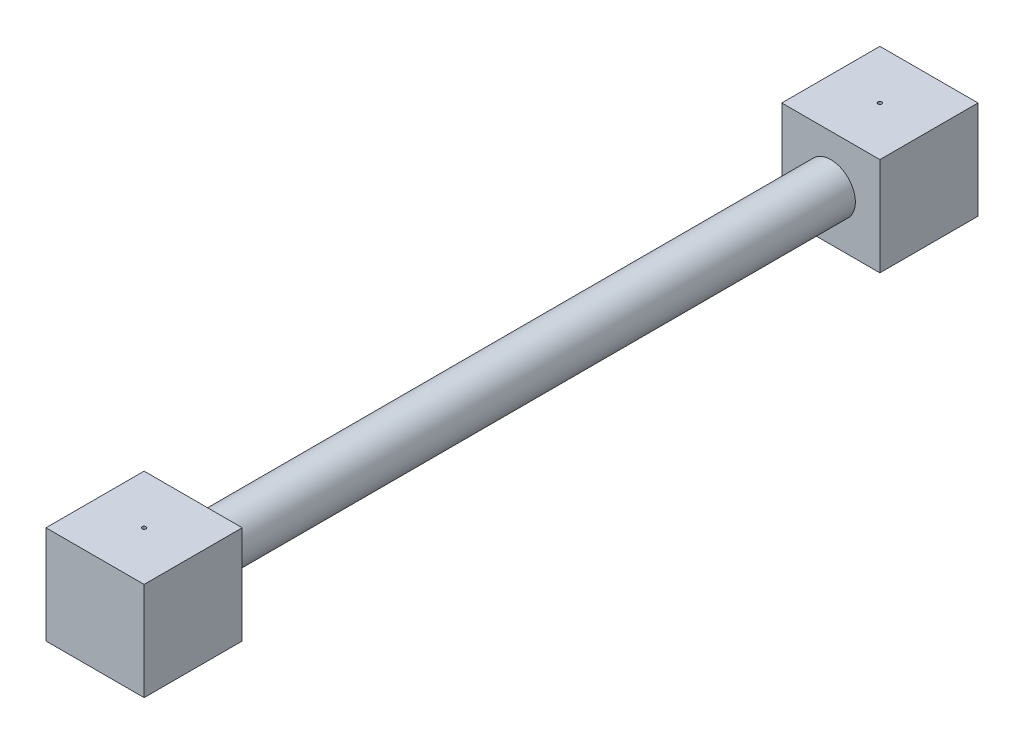
ISO-10303-21;
HEADER;
FILE_DESCRIPTION(('STEP AP214'),'2;1');
FILE_NAME('part.step','',(''),(''),'','','');
FILE_SCHEMA(('AUTOMOTIVE_DESIGN { 1 0 10303 214 1 1 1 1 }'));
ENDSEC;
DATA;
#1=APPLICATION_CONTEXT('core data for automotive mechanical design processes');
#2=APPLICATION_PROTOCOL_DEFINITION('international standard','automotive_design',2000,#1);
#3=PRODUCT_CONTEXT('',#1,'mechanical');
#4=PRODUCT('Part','Part','',(#3));
#5=PRODUCT_RELATED_PRODUCT_CATEGORY('part','',(#4));
#6=PRODUCT_DEFINITION_FORMATION('','',#4);
#7=PRODUCT_DEFINITION_CONTEXT('part definition',#1,'design');
#8=PRODUCT_DEFINITION('design','',#6,#7);
#9=PRODUCT_DEFINITION_SHAPE('','',#8);
#10=(LENGTH_UNIT() NAMED_UNIT(*) SI_UNIT(.MILLI.,.METRE.));
#11=(NAMED_UNIT(*) PLANE_ANGLE_UNIT() SI_UNIT($,.RADIAN.));
#12=(NAMED_UNIT(*) SI_UNIT($,.STERADIAN.) SOLID_ANGLE_UNIT());
#13=UNCERTAINTY_MEASURE_WITH_UNIT(LENGTH_MEASURE(1.E-05),#10,'distance_accuracy_value','');
#14=(GEOMETRIC_REPRESENTATION_CONTEXT(3) GLOBAL_UNCERTAINTY_ASSIGNED_CONTEXT((#13)) GLOBAL_UNIT_ASSIGNED_CONTEXT((#10,
#11,#12)) REPRESENTATION_CONTEXT('',''));
#15=CARTESIAN_POINT('',(0.,0.,0.));
#16=DIRECTION('',(0.,0.,1.));
#17=DIRECTION('',(1.,0.,0.));
#18=AXIS2_PLACEMENT_3D('',#15,#16,#17);
#19=CARTESIAN_POINT('',(-25.4,-25.4,-25.4));
#20=DIRECTION('',(1.,0.,0.));
#21=DIRECTION('',(0.,0.,-1.));
#22=AXIS2_PLACEMENT_3D('',#19,#20,#21);
#23=PLANE('',#22);
#24=DIRECTION('',(0.,1.,0.));
#25=VECTOR('',#24,1.);
#26=CARTESIAN_POINT('',(-25.4,-25.4,25.4));
#27=LINE('',#26,#25);
#28=CARTESIAN_POINT('',(-25.4,-25.4,25.4));
#29=VERTEX_POINT('',#28);
#30=CARTESIAN_POINT('',(-25.4,25.4,25.4));
#31=VERTEX_POINT('',#30);
#32=EDGE_CURVE('E142',#29,#31,#27,.T.);
#33=ORIENTED_EDGE('',*,*,#32,.T.);
#34=DIRECTION('',(0.,0.,1.));
#35=VECTOR('',#34,1.);
#36=CARTESIAN_POINT('',(-25.4,25.4,-25.4));
#37=LINE('',#36,#35);
#38=CARTESIAN_POINT('',(-25.4,25.4,-25.4));
#39=VERTEX_POINT('',#38);
#40=EDGE_CURVE('E48',#39,#31,#37,.T.);
#41=ORIENTED_EDGE('',*,*,#40,.F.);
#42=DIRECTION('',(0.,1.,0.));
#43=VECTOR('',#42,1.);
#44=CARTESIAN_POINT('',(-25.4,-25.4,-25.4));
#45=LINE('',#44,#43);
#46=CARTESIAN_POINT('',(-25.4,-25.4,-25.4));
#47=VERTEX_POINT('',#46);
#48=EDGE_CURVE('E147',#47,#39,#45,.T.);
#49=ORIENTED_EDGE('',*,*,#48,.F.);
#50=DIRECTION('',(0.,0.,1.));
#51=VECTOR('',#50,1.);
#52=CARTESIAN_POINT('',(-25.4,-25.4,-25.4));
#53=LINE('',#52,#51);
#54=EDGE_CURVE('E153',#47,#29,#53,.T.);
#55=ORIENTED_EDGE('',*,*,#54,.T.);
#56=EDGE_LOOP('',(#33,#41,#49,#55));
#57=FACE_BOUND('',#56,.T.);
#58=ADVANCED_FACE('F38',(#57),#23,.F.);
#59=CARTESIAN_POINT('',(25.4,25.4,-25.4));
#60=DIRECTION('',(0.,-1.,0.));
#61=DIRECTION('',(0.,0.,-1.));
#62=AXIS2_PLACEMENT_3D('',#59,#60,#61);
#63=PLANE('',#62);
#64=CARTESIAN_POINT('',(0.,25.4,0.));
#65=DIRECTION('',(0.,1.,0.));
#66=DIRECTION('',(0.,0.,1.));
#67=AXIS2_PLACEMENT_3D('',#64,#65,#66);
#68=CIRCLE('',#67,0.9921875);
#69=CARTESIAN_POINT('',(0.,25.4,0.9921875));
#70=VERTEX_POINT('',#69);
#71=EDGE_CURVE('E202',#70,#70,#68,.T.);
#72=ORIENTED_EDGE('',*,*,#71,.F.);
#73=EDGE_LOOP('',(#72));
#74=FACE_BOUND('',#73,.T.);
#75=DIRECTION('',(1.,0.,0.));
#76=VECTOR('',#75,1.);
#77=CARTESIAN_POINT('',(25.4,25.4,25.4));
#78=LINE('',#77,#76);
#79=CARTESIAN_POINT('',(25.4,25.4,25.4));
#80=VERTEX_POINT('',#79);
#81=EDGE_CURVE('E156',#31,#80,#78,.T.);
#82=ORIENTED_EDGE('',*,*,#81,.T.);
#83=DIRECTION('',(0.,0.,1.));
#84=VECTOR('',#83,1.);
#85=CARTESIAN_POINT('',(25.4,25.4,-25.4));
#86=LINE('',#85,#84);
#87=CARTESIAN_POINT('',(25.4,25.4,-25.4));
#88=VERTEX_POINT('',#87);
#89=EDGE_CURVE('E163',#88,#80,#86,.T.);
#90=ORIENTED_EDGE('',*,*,#89,.F.);
#91=DIRECTION('',(1.,0.,0.));
#92=VECTOR('',#91,1.);
#93=CARTESIAN_POINT('',(25.4,25.4,-25.4));
#94=LINE('',#93,#92);
#95=EDGE_CURVE('E88',#39,#88,#94,.T.);
#96=ORIENTED_EDGE('',*,*,#95,.F.);
#97=ORIENTED_EDGE('',*,*,#40,.T.);
#98=EDGE_LOOP('',(#82,#90,#96,#97));
#99=FACE_BOUND('',#98,.T.);
#100=ADVANCED_FACE('F166',(#74,#99),#63,.F.);
#101=CARTESIAN_POINT('',(25.4,-25.4,-25.4));
#102=DIRECTION('',(-1.,0.,0.));
#103=DIRECTION('',(0.,0.,1.));
#104=AXIS2_PLACEMENT_3D('',#101,#102,#103);
#105=PLANE('',#104);
#106=DIRECTION('',(0.,-1.,0.));
#107=VECTOR('',#106,1.);
#108=CARTESIAN_POINT('',(25.4,-25.4,25.4));
#109=LINE('',#108,#107);
#110=CARTESIAN_POINT('',(25.4,-25.4,25.4));
#111=VERTEX_POINT('',#110);
#112=EDGE_CURVE('E74',#80,#111,#109,.T.);
#113=ORIENTED_EDGE('',*,*,#112,.T.);
#114=DIRECTION('',(0.,0.,1.));
#115=VECTOR('',#114,1.);
#116=CARTESIAN_POINT('',(25.4,-25.4,-25.4));
#117=LINE('',#116,#115);
#118=CARTESIAN_POINT('',(25.4,-25.4,-25.4));
#119=VERTEX_POINT('',#118);
#120=EDGE_CURVE('E161',#119,#111,#117,.T.);
#121=ORIENTED_EDGE('',*,*,#120,.F.);
#122=DIRECTION('',(0.,-1.,0.));
#123=VECTOR('',#122,1.);
#124=CARTESIAN_POINT('',(25.4,-25.4,-25.4));
#125=LINE('',#124,#123);
#126=EDGE_CURVE('E150',#88,#119,#125,.T.);
#127=ORIENTED_EDGE('',*,*,#126,.F.);
#128=ORIENTED_EDGE('',*,*,#89,.T.);
#129=EDGE_LOOP('',(#113,#121,#127,#128));
#130=FACE_BOUND('',#129,.T.);
#131=ADVANCED_FACE('F189',(#130),#105,.F.);
#132=CARTESIAN_POINT('',(25.4,-25.4,-25.4));
#133=DIRECTION('',(0.,1.,0.));
#134=DIRECTION('',(0.,0.,1.));
#135=AXIS2_PLACEMENT_3D('',#132,#133,#134);
#136=PLANE('',#135);
#137=CARTESIAN_POINT('',(0.,-25.4,0.));
#138=DIRECTION('',(0.,1.,0.));
#139=DIRECTION('',(0.,0.,1.));
#140=AXIS2_PLACEMENT_3D('',#137,#138,#139);
#141=CIRCLE('',#140,0.9921875);
#142=CARTESIAN_POINT('',(0.,-25.4,0.9921875));
#143=VERTEX_POINT('',#142);
#144=EDGE_CURVE('E200',#143,#143,#141,.T.);
#145=ORIENTED_EDGE('',*,*,#144,.T.);
#146=EDGE_LOOP('',(#145));
#147=FACE_BOUND('',#146,.T.);
#148=DIRECTION('',(-1.,0.,0.));
#149=VECTOR('',#148,1.);
#150=CARTESIAN_POINT('',(25.4,-25.4,25.4));
#151=LINE('',#150,#149);
#152=EDGE_CURVE('E80',#111,#29,#151,.T.);
#153=ORIENTED_EDGE('',*,*,#152,.T.);
#154=ORIENTED_EDGE('',*,*,#54,.F.);
#155=DIRECTION('',(-1.,0.,0.));
#156=VECTOR('',#155,1.);
#157=CARTESIAN_POINT('',(25.4,-25.4,-25.4));
#158=LINE('',#157,#156);
#159=EDGE_CURVE('E56',#119,#47,#158,.T.);
#160=ORIENTED_EDGE('',*,*,#159,.F.);
#161=ORIENTED_EDGE('',*,*,#120,.T.);
#162=EDGE_LOOP('',(#153,#154,#160,#161));
#163=FACE_BOUND('',#162,.T.);
#164=ADVANCED_FACE('F181',(#147,#163),#136,.F.);
#165=CARTESIAN_POINT('',(0.,0.,-25.4));
#166=DIRECTION('',(0.,0.,1.));
#167=DIRECTION('',(1.,0.,0.));
#168=AXIS2_PLACEMENT_3D('',#165,#166,#167);
#169=PLANE('',#168);
#170=ORIENTED_EDGE('',*,*,#48,.T.);
#171=ORIENTED_EDGE('',*,*,#95,.T.);
#172=ORIENTED_EDGE('',*,*,#126,.T.);
#173=ORIENTED_EDGE('',*,*,#159,.T.);
#174=EDGE_LOOP('',(#170,#171,#172,#173));
#175=FACE_BOUND('',#174,.T.);
#176=ADVANCED_FACE('F173',(#175),#169,.F.);
#177=CARTESIAN_POINT('',(0.,0.,25.4));
#178=DIRECTION('',(0.,0.,1.));
#179=DIRECTION('',(1.,0.,0.));
#180=AXIS2_PLACEMENT_3D('',#177,#178,#179);
#181=PLANE('',#180);
#182=CARTESIAN_POINT('',(0.,0.,25.4));
#183=DIRECTION('',(0.,0.,1.));
#184=DIRECTION('',(1.,0.,0.));
#185=AXIS2_PLACEMENT_3D('',#182,#183,#184);
#186=CIRCLE('',#185,12.7);
#187=CARTESIAN_POINT('',(12.7,0.,25.4));
#188=VERTEX_POINT('',#187);
#189=EDGE_CURVE('E11',#188,#188,#186,.T.);
#190=ORIENTED_EDGE('',*,*,#189,.F.);
#191=EDGE_LOOP('',(#190));
#192=FACE_BOUND('',#191,.T.);
#193=ORIENTED_EDGE('',*,*,#32,.F.);
#194=ORIENTED_EDGE('',*,*,#152,.F.);
#195=ORIENTED_EDGE('',*,*,#112,.F.);
#196=ORIENTED_EDGE('',*,*,#81,.F.);
#197=EDGE_LOOP('',(#193,#194,#195,#196));
#198=FACE_BOUND('',#197,.T.);
#199=ADVANCED_FACE('F171',(#192,#198),#181,.T.);
#200=CARTESIAN_POINT('',(0.,0.,381.));
#201=DIRECTION('',(0.,0.,-1.));
#202=DIRECTION('',(-1.,0.,0.));
#203=AXIS2_PLACEMENT_3D('',#200,#201,#202);
#204=CYLINDRICAL_SURFACE('',#203,12.7);
#205=CARTESIAN_POINT('',(0.,0.,355.6));
#206=DIRECTION('',(0.,0.,-1.));
#207=DIRECTION('',(-1.,0.,0.));
#208=AXIS2_PLACEMENT_3D('',#205,#206,#207);
#209=CIRCLE('',#208,12.7);
#210=CARTESIAN_POINT('',(-12.7,0.,355.6));
#211=VERTEX_POINT('',#210);
#212=EDGE_CURVE('E42',#211,#211,#209,.T.);
#213=ORIENTED_EDGE('',*,*,#212,.T.);
#214=EDGE_LOOP('',(#213));
#215=FACE_BOUND('',#214,.T.);
#216=ORIENTED_EDGE('',*,*,#189,.T.);
#217=EDGE_LOOP('',(#216));
#218=FACE_BOUND('',#217,.T.);
#219=ADVANCED_FACE('F40',(#215,#218),#204,.T.);
#220=CARTESIAN_POINT('',(25.4,-25.4,406.4));
#221=DIRECTION('',(-1.,0.,0.));
#222=DIRECTION('',(0.,0.,1.));
#223=AXIS2_PLACEMENT_3D('',#220,#221,#222);
#224=PLANE('',#223);
#225=DIRECTION('',(0.,1.,0.));
#226=VECTOR('',#225,1.);
#227=CARTESIAN_POINT('',(25.4,-25.4,355.6));
#228=LINE('',#227,#226);
#229=CARTESIAN_POINT('',(25.4,-25.4,355.6));
#230=VERTEX_POINT('',#229);
#231=CARTESIAN_POINT('',(25.4,25.4,355.6));
#232=VERTEX_POINT('',#231);
#233=EDGE_CURVE('E139',#230,#232,#228,.T.);
#234=ORIENTED_EDGE('',*,*,#233,.T.);
#235=DIRECTION('',(0.,0.,-1.));
#236=VECTOR('',#235,1.);
#237=CARTESIAN_POINT('',(25.4,25.4,406.4));
#238=LINE('',#237,#236);
#239=CARTESIAN_POINT('',(25.4,25.4,406.4));
#240=VERTEX_POINT('',#239);
#241=EDGE_CURVE('E119',#240,#232,#238,.T.);
#242=ORIENTED_EDGE('',*,*,#241,.F.);
#243=DIRECTION('',(0.,1.,0.));
#244=VECTOR('',#243,1.);
#245=CARTESIAN_POINT('',(25.4,-25.4,406.4));
#246=LINE('',#245,#244);
#247=CARTESIAN_POINT('',(25.4,-25.4,406.4));
#248=VERTEX_POINT('',#247);
#249=EDGE_CURVE('E126',#248,#240,#246,.T.);
#250=ORIENTED_EDGE('',*,*,#249,.F.);
#251=DIRECTION('',(0.,0.,-1.));
#252=VECTOR('',#251,1.);
#253=CARTESIAN_POINT('',(25.4,-25.4,406.4));
#254=LINE('',#253,#252);
#255=EDGE_CURVE('E211',#248,#230,#254,.T.);
#256=ORIENTED_EDGE('',*,*,#255,.T.);
#257=EDGE_LOOP('',(#234,#242,#250,#256));
#258=FACE_BOUND('',#257,.T.);
#259=ADVANCED_FACE('F137',(#258),#224,.F.);
#260=CARTESIAN_POINT('',(-25.4,25.4,406.4));
#261=DIRECTION('',(0.,-1.,0.));
#262=DIRECTION('',(0.,0.,-1.));
#263=AXIS2_PLACEMENT_3D('',#260,#261,#262);
#264=PLANE('',#263);
#265=CARTESIAN_POINT('',(0.,25.4,381.));
#266=DIRECTION('',(0.,1.,0.));
#267=DIRECTION('',(0.,0.,1.));
#268=AXIS2_PLACEMENT_3D('',#265,#266,#267);
#269=CIRCLE('',#268,1.01599999999999);
#270=CARTESIAN_POINT('',(0.,25.4,382.016));
#271=VERTEX_POINT('',#270);
#272=EDGE_CURVE('E205',#271,#271,#269,.T.);
#273=ORIENTED_EDGE('',*,*,#272,.F.);
#274=EDGE_LOOP('',(#273));
#275=FACE_BOUND('',#274,.T.);
#276=DIRECTION('',(-1.,0.,0.));
#277=VECTOR('',#276,1.);
#278=CARTESIAN_POINT('',(-25.4,25.4,355.6));
#279=LINE('',#278,#277);
#280=CARTESIAN_POINT('',(-25.4,25.4,355.6));
#281=VERTEX_POINT('',#280);
#282=EDGE_CURVE('E213',#232,#281,#279,.T.);
#283=ORIENTED_EDGE('',*,*,#282,.T.);
#284=DIRECTION('',(0.,0.,-1.));
#285=VECTOR('',#284,1.);
#286=CARTESIAN_POINT('',(-25.4,25.4,406.4));
#287=LINE('',#286,#285);
#288=CARTESIAN_POINT('',(-25.4,25.4,406.4));
#289=VERTEX_POINT('',#288);
#290=EDGE_CURVE('E122',#289,#281,#287,.T.);
#291=ORIENTED_EDGE('',*,*,#290,.F.);
#292=DIRECTION('',(-1.,0.,0.));
#293=VECTOR('',#292,1.);
#294=CARTESIAN_POINT('',(-25.4,25.4,406.4));
#295=LINE('',#294,#293);
#296=EDGE_CURVE('E115',#240,#289,#295,.T.);
#297=ORIENTED_EDGE('',*,*,#296,.F.);
#298=ORIENTED_EDGE('',*,*,#241,.T.);
#299=EDGE_LOOP('',(#283,#291,#297,#298));
#300=FACE_BOUND('',#299,.T.);
#301=ADVANCED_FACE('F117',(#275,#300),#264,.F.);
#302=CARTESIAN_POINT('',(-25.4,-25.4,406.4));
#303=DIRECTION('',(1.,0.,0.));
#304=DIRECTION('',(0.,0.,-1.));
#305=AXIS2_PLACEMENT_3D('',#302,#303,#304);
#306=PLANE('',#305);
#307=DIRECTION('',(0.,-1.,0.));
#308=VECTOR('',#307,1.);
#309=CARTESIAN_POINT('',(-25.4,-25.4,355.6));
#310=LINE('',#309,#308);
#311=CARTESIAN_POINT('',(-25.4,-25.4,355.6));
#312=VERTEX_POINT('',#311);
#313=EDGE_CURVE('E216',#281,#312,#310,.T.);
#314=ORIENTED_EDGE('',*,*,#313,.T.);
#315=DIRECTION('',(0.,0.,-1.));
#316=VECTOR('',#315,1.);
#317=CARTESIAN_POINT('',(-25.4,-25.4,406.4));
#318=LINE('',#317,#316);
#319=CARTESIAN_POINT('',(-25.4,-25.4,406.4));
#320=VERTEX_POINT('',#319);
#321=EDGE_CURVE('E143',#320,#312,#318,.T.);
#322=ORIENTED_EDGE('',*,*,#321,.F.);
#323=DIRECTION('',(0.,-1.,0.));
#324=VECTOR('',#323,1.);
#325=CARTESIAN_POINT('',(-25.4,-25.4,406.4));
#326=LINE('',#325,#324);
#327=EDGE_CURVE('E125',#289,#320,#326,.T.);
#328=ORIENTED_EDGE('',*,*,#327,.F.);
#329=ORIENTED_EDGE('',*,*,#290,.T.);
#330=EDGE_LOOP('',(#314,#322,#328,#329));
#331=FACE_BOUND('',#330,.T.);
#332=ADVANCED_FACE('F228',(#331),#306,.F.);
#333=CARTESIAN_POINT('',(-25.4,-25.4,406.4));
#334=DIRECTION('',(0.,1.,0.));
#335=DIRECTION('',(0.,0.,1.));
#336=AXIS2_PLACEMENT_3D('',#333,#334,#335);
#337=PLANE('',#336);
#338=CARTESIAN_POINT('',(0.,-25.4,381.));
#339=DIRECTION('',(0.,1.,0.));
#340=DIRECTION('',(0.,0.,1.));
#341=AXIS2_PLACEMENT_3D('',#338,#339,#340);
#342=CIRCLE('',#341,1.01599999999999);
#343=CARTESIAN_POINT('',(0.,-25.4,382.016));
#344=VERTEX_POINT('',#343);
#345=EDGE_CURVE('E214',#344,#344,#342,.T.);
#346=ORIENTED_EDGE('',*,*,#345,.T.);
#347=EDGE_LOOP('',(#346));
#348=FACE_BOUND('',#347,.T.);
#349=DIRECTION('',(1.,0.,0.));
#350=VECTOR('',#349,1.);
#351=CARTESIAN_POINT('',(-25.4,-25.4,355.6));
#352=LINE('',#351,#350);
#353=EDGE_CURVE('E135',#312,#230,#352,.T.);
#354=ORIENTED_EDGE('',*,*,#353,.T.);
#355=ORIENTED_EDGE('',*,*,#255,.F.);
#356=DIRECTION('',(1.,0.,0.));
#357=VECTOR('',#356,1.);
#358=CARTESIAN_POINT('',(-25.4,-25.4,406.4));
#359=LINE('',#358,#357);
#360=EDGE_CURVE('E131',#320,#248,#359,.T.);
#361=ORIENTED_EDGE('',*,*,#360,.F.);
#362=ORIENTED_EDGE('',*,*,#321,.T.);
#363=EDGE_LOOP('',(#354,#355,#361,#362));
#364=FACE_BOUND('',#363,.T.);
#365=ADVANCED_FACE('F223',(#348,#364),#337,.F.);
#366=CARTESIAN_POINT('',(0.,0.,406.4));
#367=DIRECTION('',(0.,0.,-1.));
#368=DIRECTION('',(-1.,0.,0.));
#369=AXIS2_PLACEMENT_3D('',#366,#367,#368);
#370=PLANE('',#369);
#371=ORIENTED_EDGE('',*,*,#249,.T.);
#372=ORIENTED_EDGE('',*,*,#296,.T.);
#373=ORIENTED_EDGE('',*,*,#327,.T.);
#374=ORIENTED_EDGE('',*,*,#360,.T.);
#375=EDGE_LOOP('',(#371,#372,#373,#374));
#376=FACE_BOUND('',#375,.T.);
#377=ADVANCED_FACE('F129',(#376),#370,.F.);
#378=CARTESIAN_POINT('',(0.,0.,355.6));
#379=DIRECTION('',(0.,0.,-1.));
#380=DIRECTION('',(-1.,0.,0.));
#381=AXIS2_PLACEMENT_3D('',#378,#379,#380);
#382=PLANE('',#381);
#383=ORIENTED_EDGE('',*,*,#212,.F.);
#384=EDGE_LOOP('',(#383));
#385=FACE_BOUND('',#384,.T.);
#386=ORIENTED_EDGE('',*,*,#233,.F.);
#387=ORIENTED_EDGE('',*,*,#353,.F.);
#388=ORIENTED_EDGE('',*,*,#313,.F.);
#389=ORIENTED_EDGE('',*,*,#282,.F.);
#390=EDGE_LOOP('',(#386,#387,#388,#389));
#391=FACE_BOUND('',#390,.T.);
#392=ADVANCED_FACE('F227',(#385,#391),#382,.T.);
#393=CARTESIAN_POINT('',(0.,-25.4,381.));
#394=DIRECTION('',(0.,1.,0.));
#395=DIRECTION('',(0.,0.,1.));
#396=AXIS2_PLACEMENT_3D('',#393,#394,#395);
#397=CYLINDRICAL_SURFACE('',#396,1.01599999999999);
#398=CARTESIAN_POINT('',(0.,-25.4,382.016));
#399=CARTESIAN_POINT('',(0.,-24.8708333333333,382.016));
#400=CARTESIAN_POINT('',(0.,-24.3416666666667,382.016));
#401=CARTESIAN_POINT('',(0.,-23.2833333333333,382.016));
#402=CARTESIAN_POINT('',(0.,-22.7541666666667,382.016));
#403=CARTESIAN_POINT('',(0.,-21.6958333333333,382.016));
#404=CARTESIAN_POINT('',(0.,-21.1666666666667,382.016));
#405=CARTESIAN_POINT('',(0.,-20.1083333333333,382.016));
#406=CARTESIAN_POINT('',(0.,-19.5791666666667,382.016));
#407=CARTESIAN_POINT('',(0.,-18.5208333333333,382.016));
#408=CARTESIAN_POINT('',(0.,-17.9916666666667,382.016));
#409=CARTESIAN_POINT('',(0.,-16.9333333333333,382.016));
#410=CARTESIAN_POINT('',(0.,-16.4041666666667,382.016));
#411=CARTESIAN_POINT('',(0.,-15.3458333333333,382.016));
#412=CARTESIAN_POINT('',(0.,-14.8166666666667,382.016));
#413=CARTESIAN_POINT('',(0.,-13.7583333333333,382.016));
#414=CARTESIAN_POINT('',(0.,-13.2291666666667,382.016));
#415=CARTESIAN_POINT('',(0.,-12.1708333333333,382.016));
#416=CARTESIAN_POINT('',(0.,-11.6416666666667,382.016));
#417=CARTESIAN_POINT('',(0.,-10.5833333333333,382.016));
#418=CARTESIAN_POINT('',(0.,-10.0541666666667,382.016));
#419=CARTESIAN_POINT('',(0.,-8.99583333333334,382.016));
#420=CARTESIAN_POINT('',(0.,-8.46666666666667,382.016));
#421=CARTESIAN_POINT('',(0.,-7.40833333333333,382.016));
#422=CARTESIAN_POINT('',(0.,-6.87916666666667,382.016));
#423=CARTESIAN_POINT('',(0.,-5.82083333333334,382.016));
#424=CARTESIAN_POINT('',(0.,-5.29166666666667,382.016));
#425=CARTESIAN_POINT('',(0.,-4.23333333333334,382.016));
#426=CARTESIAN_POINT('',(0.,-3.70416666666667,382.016));
#427=CARTESIAN_POINT('',(0.,-2.64583333333333,382.016));
#428=CARTESIAN_POINT('',(0.,-2.11666666666667,382.016));
#429=CARTESIAN_POINT('',(0.,-1.05833333333333,382.016));
#430=CARTESIAN_POINT('',(0.,-0.529166666666666,382.016));
#431=CARTESIAN_POINT('',(0.,0.529166666666666,382.016));
#432=CARTESIAN_POINT('',(0.,1.05833333333333,382.016));
#433=CARTESIAN_POINT('',(0.,2.11666666666667,382.016));
#434=CARTESIAN_POINT('',(0.,2.64583333333333,382.016));
#435=CARTESIAN_POINT('',(0.,3.70416666666667,382.016));
#436=CARTESIAN_POINT('',(0.,4.23333333333334,382.016));
#437=CARTESIAN_POINT('',(0.,5.29166666666667,382.016));
#438=CARTESIAN_POINT('',(0.,5.82083333333333,382.016));
#439=CARTESIAN_POINT('',(0.,6.87916666666666,382.016));
#440=CARTESIAN_POINT('',(0.,7.40833333333333,382.016));
#441=CARTESIAN_POINT('',(0.,8.46666666666667,382.016));
#442=CARTESIAN_POINT('',(0.,8.99583333333333,382.016));
#443=CARTESIAN_POINT('',(0.,10.0541666666667,382.016));
#444=CARTESIAN_POINT('',(0.,10.5833333333333,382.016));
#445=CARTESIAN_POINT('',(0.,11.6416666666667,382.016));
#446=CARTESIAN_POINT('',(0.,12.1708333333333,382.016));
#447=CARTESIAN_POINT('',(0.,13.2291666666667,382.016));
#448=CARTESIAN_POINT('',(0.,13.7583333333333,382.016));
#449=CARTESIAN_POINT('',(0.,14.8166666666667,382.016));
#450=CARTESIAN_POINT('',(0.,15.3458333333333,382.016));
#451=CARTESIAN_POINT('',(0.,16.4041666666667,382.016));
#452=CARTESIAN_POINT('',(0.,16.9333333333333,382.016));
#453=CARTESIAN_POINT('',(0.,17.9916666666667,382.016));
#454=CARTESIAN_POINT('',(0.,18.5208333333333,382.016));
#455=CARTESIAN_POINT('',(0.,19.5791666666667,382.016));
#456=CARTESIAN_POINT('',(0.,20.1083333333333,382.016));
#457=CARTESIAN_POINT('',(0.,21.1666666666667,382.016));
#458=CARTESIAN_POINT('',(0.,21.6958333333333,382.016));
#459=CARTESIAN_POINT('',(0.,22.7541666666667,382.016));
#460=CARTESIAN_POINT('',(0.,23.2833333333333,382.016));
#461=CARTESIAN_POINT('',(0.,24.3416666666667,382.016));
#462=CARTESIAN_POINT('',(0.,24.8708333333333,382.016));
#463=CARTESIAN_POINT('',(0.,25.4,382.016));
#464=B_SPLINE_CURVE_WITH_KNOTS('',3,(#398,#399,#400,#401,#402,#403,#404,#405,#406,#407,#408,
#409,#410,#411,#412,#413,#414,#415,#416,#417,#418,#419,#420,#421,#422,#423,#424,#425,#426,#427,
#428,#429,#430,#431,#432,#433,#434,#435,#436,#437,#438,#439,#440,#441,#442,#443,#444,#445,#446,
#447,#448,#449,#450,#451,#452,#453,#454,#455,#456,#457,#458,#459,#460,#461,#462,#463),
.UNSPECIFIED.,.F.,.F.,(4,2,2,2,2,2,2,2,2,2,2,2,2,2,2,2,2,2,2,2,2,2,2,2,2,2,2,2,2,2,2,2,4),(0.,
1.5875,3.175,4.7625,6.35,7.9375,9.525,11.1125,12.7,14.2875,15.875,17.4625,19.05,20.6375,22.225,
23.8125,25.4,26.9875,28.575,30.1625,31.75,33.3375,34.925,36.5125,38.1,39.6875,41.275,42.8625,
44.45,46.0375,47.625,49.2125,50.8),.UNSPECIFIED.);
#465=EDGE_CURVE('BSEAM269',#344,#271,#464,.T.);
#466=ORIENTED_EDGE('',*,*,#345,.F.);
#467=ORIENTED_EDGE('',*,*,#272,.T.);
#468=ORIENTED_EDGE('',*,*,#465,.T.);
#469=ORIENTED_EDGE('',*,*,#465,.F.);
#470=EDGE_LOOP('',(#466,#468,#467,#469));
#471=FACE_BOUND('',#470,.T.);
#472=ADVANCED_FACE('F269',(#471),#397,.F.);
#473=CARTESIAN_POINT('',(0.,-25.4,0.));
#474=DIRECTION('',(0.,1.,0.));
#475=DIRECTION('',(0.,0.,1.));
#476=AXIS2_PLACEMENT_3D('',#473,#474,#475);
#477=CYLINDRICAL_SURFACE('',#476,0.9921875);
#478=CARTESIAN_POINT('',(0.,-25.4,0.9921875));
#479=CARTESIAN_POINT('',(0.,-24.8708333333333,0.9921875));
#480=CARTESIAN_POINT('',(0.,-24.3416666666667,0.9921875));
#481=CARTESIAN_POINT('',(0.,-23.2833333333333,0.9921875));
#482=CARTESIAN_POINT('',(0.,-22.7541666666667,0.9921875));
#483=CARTESIAN_POINT('',(0.,-21.6958333333333,0.9921875));
#484=CARTESIAN_POINT('',(0.,-21.1666666666667,0.9921875));
#485=CARTESIAN_POINT('',(0.,-20.1083333333333,0.9921875));
#486=CARTESIAN_POINT('',(0.,-19.5791666666667,0.9921875));
#487=CARTESIAN_POINT('',(0.,-18.5208333333333,0.9921875));
#488=CARTESIAN_POINT('',(0.,-17.9916666666667,0.9921875));
#489=CARTESIAN_POINT('',(0.,-16.9333333333333,0.9921875));
#490=CARTESIAN_POINT('',(0.,-16.4041666666667,0.9921875));
#491=CARTESIAN_POINT('',(0.,-15.3458333333333,0.9921875));
#492=CARTESIAN_POINT('',(0.,-14.8166666666667,0.9921875));
#493=CARTESIAN_POINT('',(0.,-13.7583333333333,0.9921875));
#494=CARTESIAN_POINT('',(0.,-13.2291666666667,0.9921875));
#495=CARTESIAN_POINT('',(0.,-12.1708333333333,0.9921875));
#496=CARTESIAN_POINT('',(0.,-11.6416666666667,0.9921875));
#497=CARTESIAN_POINT('',(0.,-10.5833333333333,0.9921875));
#498=CARTESIAN_POINT('',(0.,-10.0541666666667,0.9921875));
#499=CARTESIAN_POINT('',(0.,-8.99583333333334,0.9921875));
#500=CARTESIAN_POINT('',(0.,-8.46666666666667,0.9921875));
#501=CARTESIAN_POINT('',(0.,-7.40833333333334,0.9921875));
#502=CARTESIAN_POINT('',(0.,-6.87916666666667,0.9921875));
#503=CARTESIAN_POINT('',(0.,-5.82083333333334,0.9921875));
#504=CARTESIAN_POINT('',(0.,-5.29166666666667,0.9921875));
#505=CARTESIAN_POINT('',(0.,-4.23333333333334,0.9921875));
#506=CARTESIAN_POINT('',(0.,-3.70416666666667,0.9921875));
#507=CARTESIAN_POINT('',(0.,-2.64583333333334,0.9921875));
#508=CARTESIAN_POINT('',(0.,-2.11666666666667,0.9921875));
#509=CARTESIAN_POINT('',(0.,-1.05833333333334,0.9921875));
#510=CARTESIAN_POINT('',(0.,-0.52916666666667,0.9921875));
#511=CARTESIAN_POINT('',(0.,0.529166666666663,0.9921875));
#512=CARTESIAN_POINT('',(0.,1.05833333333333,0.9921875));
#513=CARTESIAN_POINT('',(0.,2.11666666666666,0.9921875));
#514=CARTESIAN_POINT('',(0.,2.64583333333333,0.9921875));
#515=CARTESIAN_POINT('',(0.,3.70416666666666,0.9921875));
#516=CARTESIAN_POINT('',(0.,4.23333333333333,0.9921875));
#517=CARTESIAN_POINT('',(0.,5.29166666666667,0.9921875));
#518=CARTESIAN_POINT('',(0.,5.82083333333333,0.9921875));
#519=CARTESIAN_POINT('',(0.,6.87916666666666,0.9921875));
#520=CARTESIAN_POINT('',(0.,7.40833333333333,0.9921875));
#521=CARTESIAN_POINT('',(0.,8.46666666666667,0.9921875));
#522=CARTESIAN_POINT('',(0.,8.99583333333333,0.9921875));
#523=CARTESIAN_POINT('',(0.,10.0541666666667,0.9921875));
#524=CARTESIAN_POINT('',(0.,10.5833333333333,0.9921875));
#525=CARTESIAN_POINT('',(0.,11.6416666666667,0.9921875));
#526=CARTESIAN_POINT('',(0.,12.1708333333333,0.9921875));
#527=CARTESIAN_POINT('',(0.,13.2291666666667,0.9921875));
#528=CARTESIAN_POINT('',(0.,13.7583333333333,0.9921875));
#529=CARTESIAN_POINT('',(0.,14.8166666666667,0.9921875));
#530=CARTESIAN_POINT('',(0.,15.3458333333333,0.9921875));
#531=CARTESIAN_POINT('',(0.,16.4041666666667,0.9921875));
#532=CARTESIAN_POINT('',(0.,16.9333333333333,0.9921875));
#533=CARTESIAN_POINT('',(0.,17.9916666666667,0.9921875));
#534=CARTESIAN_POINT('',(0.,18.5208333333333,0.9921875));
#535=CARTESIAN_POINT('',(0.,19.5791666666667,0.9921875));
#536=CARTESIAN_POINT('',(0.,20.1083333333333,0.9921875));
#537=CARTESIAN_POINT('',(0.,21.1666666666667,0.9921875));
#538=CARTESIAN_POINT('',(0.,21.6958333333333,0.9921875));
#539=CARTESIAN_POINT('',(0.,22.7541666666667,0.9921875));
#540=CARTESIAN_POINT('',(0.,23.2833333333333,0.9921875));
#541=CARTESIAN_POINT('',(0.,24.3416666666667,0.9921875));
#542=CARTESIAN_POINT('',(0.,24.8708333333333,0.9921875));
#543=CARTESIAN_POINT('',(0.,25.4,0.9921875));
#544=B_SPLINE_CURVE_WITH_KNOTS('',3,(#478,#479,#480,#481,#482,#483,#484,#485,#486,#487,#488,
#489,#490,#491,#492,#493,#494,#495,#496,#497,#498,#499,#500,#501,#502,#503,#504,#505,#506,#507,
#508,#509,#510,#511,#512,#513,#514,#515,#516,#517,#518,#519,#520,#521,#522,#523,#524,#525,#526,
#527,#528,#529,#530,#531,#532,#533,#534,#535,#536,#537,#538,#539,#540,#541,#542,#543),
.UNSPECIFIED.,.F.,.F.,(4,2,2,2,2,2,2,2,2,2,2,2,2,2,2,2,2,2,2,2,2,2,2,2,2,2,2,2,2,2,2,2,4),(0.,
1.5875,3.175,4.7625,6.35,7.9375,9.525,11.1125,12.7,14.2875,15.875,17.4625,19.05,20.6375,22.225,
23.8125,25.4,26.9875,28.575,30.1625,31.75,33.3375,34.925,36.5125,38.1,39.6875,41.275,42.8625,
44.45,46.0375,47.625,49.2125,50.8),.UNSPECIFIED.);
#545=EDGE_CURVE('BSEAM274',#143,#70,#544,.T.);
#546=ORIENTED_EDGE('',*,*,#144,.F.);
#547=ORIENTED_EDGE('',*,*,#71,.T.);
#548=ORIENTED_EDGE('',*,*,#545,.T.);
#549=ORIENTED_EDGE('',*,*,#545,.F.);
#550=EDGE_LOOP('',(#546,#548,#547,#549));
#551=FACE_BOUND('',#550,.T.);
#552=ADVANCED_FACE('F274',(#551),#477,.F.);
#553=CLOSED_SHELL('',(#58,#100,#131,#164,#176,#199,#219,#259,#301,#332,#365,#377,#392,#472,#552));
#554=MANIFOLD_SOLID_BREP('B2',#553);
#555=ADVANCED_BREP_SHAPE_REPRESENTATION('',(#18,#554),#14);
#556=SHAPE_DEFINITION_REPRESENTATION(#9,#555);
ENDSEC;
END-ISO-10303-21;
